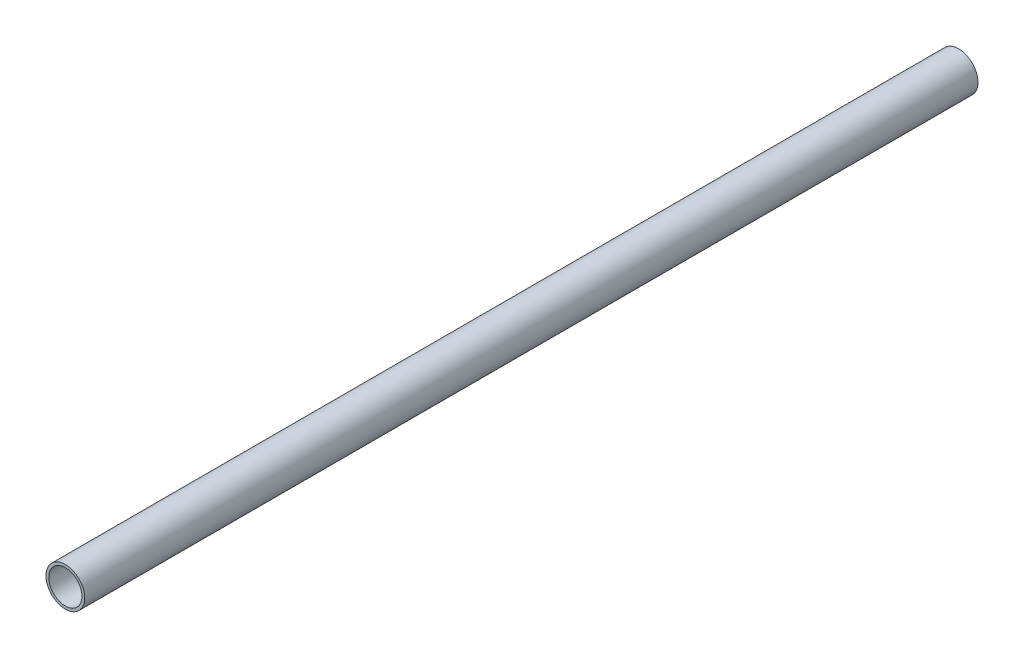
ISO-10303-21;
HEADER;
FILE_DESCRIPTION(('STEP AP214'),'2;1');
FILE_NAME('part.step','',(''),(''),'','','');
FILE_SCHEMA(('AUTOMOTIVE_DESIGN { 1 0 10303 214 1 1 1 1 }'));
ENDSEC;
DATA;
#1=APPLICATION_CONTEXT('core data for automotive mechanical design processes');
#2=APPLICATION_PROTOCOL_DEFINITION('international standard','automotive_design',2000,#1);
#3=PRODUCT_CONTEXT('',#1,'mechanical');
#4=PRODUCT('Part','Part','',(#3));
#5=PRODUCT_RELATED_PRODUCT_CATEGORY('part','',(#4));
#6=PRODUCT_DEFINITION_FORMATION('','',#4);
#7=PRODUCT_DEFINITION_CONTEXT('part definition',#1,'design');
#8=PRODUCT_DEFINITION('design','',#6,#7);
#9=PRODUCT_DEFINITION_SHAPE('','',#8);
#10=(LENGTH_UNIT() NAMED_UNIT(*) SI_UNIT(.MILLI.,.METRE.));
#11=(NAMED_UNIT(*) PLANE_ANGLE_UNIT() SI_UNIT($,.RADIAN.));
#12=(NAMED_UNIT(*) SI_UNIT($,.STERADIAN.) SOLID_ANGLE_UNIT());
#13=UNCERTAINTY_MEASURE_WITH_UNIT(LENGTH_MEASURE(1.E-05),#10,'distance_accuracy_value','');
#14=(GEOMETRIC_REPRESENTATION_CONTEXT(3) GLOBAL_UNCERTAINTY_ASSIGNED_CONTEXT((#13)) GLOBAL_UNIT_ASSIGNED_CONTEXT((#10,
#11,#12)) REPRESENTATION_CONTEXT('',''));
#15=CARTESIAN_POINT('',(0.,0.,0.));
#16=DIRECTION('',(0.,0.,1.));
#17=DIRECTION('',(1.,0.,0.));
#18=AXIS2_PLACEMENT_3D('',#15,#16,#17);
#19=CARTESIAN_POINT('',(0.,0.,256.2352));
#20=DIRECTION('',(0.,0.,1.));
#21=DIRECTION('',(1.,0.,0.));
#22=AXIS2_PLACEMENT_3D('',#19,#20,#21);
#23=PLANE('',#22);
#24=CARTESIAN_POINT('',(0.,0.,256.2352));
#25=DIRECTION('',(0.,0.,1.));
#26=DIRECTION('',(1.,0.,0.));
#27=AXIS2_PLACEMENT_3D('',#24,#25,#26);
#28=CIRCLE('',#27,11.1125);
#29=CARTESIAN_POINT('',(11.1125,0.,256.2352));
#30=VERTEX_POINT('',#29);
#31=EDGE_CURVE('E10',#30,#30,#28,.T.);
#32=ORIENTED_EDGE('',*,*,#31,.T.);
#33=EDGE_LOOP('',(#32));
#34=FACE_BOUND('',#33,.T.);
#35=CARTESIAN_POINT('',(0.,0.,256.2352));
#36=DIRECTION('',(0.,0.,1.));
#37=DIRECTION('',(1.,0.,0.));
#38=AXIS2_PLACEMENT_3D('',#35,#36,#37);
#39=CIRCLE('',#38,9.525);
#40=CARTESIAN_POINT('',(9.525,0.,256.2352));
#41=VERTEX_POINT('',#40);
#42=EDGE_CURVE('E43',#41,#41,#39,.T.);
#43=ORIENTED_EDGE('',*,*,#42,.F.);
#44=EDGE_LOOP('',(#43));
#45=FACE_BOUND('',#44,.T.);
#46=ADVANCED_FACE('F32',(#34,#45),#23,.T.);
#47=CARTESIAN_POINT('',(0.,0.,-256.2352));
#48=DIRECTION('',(0.,0.,1.));
#49=DIRECTION('',(1.,0.,0.));
#50=AXIS2_PLACEMENT_3D('',#47,#48,#49);
#51=PLANE('',#50);
#52=CARTESIAN_POINT('',(0.,0.,-256.2352));
#53=DIRECTION('',(0.,0.,1.));
#54=DIRECTION('',(1.,0.,0.));
#55=AXIS2_PLACEMENT_3D('',#52,#53,#54);
#56=CIRCLE('',#55,11.1125);
#57=CARTESIAN_POINT('',(11.1125,0.,-256.2352));
#58=VERTEX_POINT('',#57);
#59=EDGE_CURVE('E36',#58,#58,#56,.T.);
#60=ORIENTED_EDGE('',*,*,#59,.F.);
#61=EDGE_LOOP('',(#60));
#62=FACE_BOUND('',#61,.T.);
#63=CARTESIAN_POINT('',(0.,0.,-256.2352));
#64=DIRECTION('',(0.,0.,1.));
#65=DIRECTION('',(1.,0.,0.));
#66=AXIS2_PLACEMENT_3D('',#63,#64,#65);
#67=CIRCLE('',#66,9.525);
#68=CARTESIAN_POINT('',(9.525,0.,-256.2352));
#69=VERTEX_POINT('',#68);
#70=EDGE_CURVE('E45',#69,#69,#67,.T.);
#71=ORIENTED_EDGE('',*,*,#70,.T.);
#72=EDGE_LOOP('',(#71));
#73=FACE_BOUND('',#72,.T.);
#74=ADVANCED_FACE('F55',(#62,#73),#51,.F.);
#75=CARTESIAN_POINT('',(0.,0.,256.2352));
#76=DIRECTION('',(0.,0.,-1.));
#77=DIRECTION('',(-1.,0.,0.));
#78=AXIS2_PLACEMENT_3D('',#75,#76,#77);
#79=CYLINDRICAL_SURFACE('',#78,11.1125);
#80=ORIENTED_EDGE('',*,*,#31,.F.);
#81=EDGE_LOOP('',(#80));
#82=FACE_BOUND('',#81,.T.);
#83=ORIENTED_EDGE('',*,*,#59,.T.);
#84=EDGE_LOOP('',(#83));
#85=FACE_BOUND('',#84,.T.);
#86=ADVANCED_FACE('F34',(#82,#85),#79,.T.);
#87=CARTESIAN_POINT('',(0.,0.,256.2352));
#88=DIRECTION('',(0.,0.,-1.));
#89=DIRECTION('',(-1.,0.,0.));
#90=AXIS2_PLACEMENT_3D('',#87,#88,#89);
#91=CYLINDRICAL_SURFACE('',#90,9.525);
#92=ORIENTED_EDGE('',*,*,#42,.T.);
#93=EDGE_LOOP('',(#92));
#94=FACE_BOUND('',#93,.T.);
#95=ORIENTED_EDGE('',*,*,#70,.F.);
#96=EDGE_LOOP('',(#95));
#97=FACE_BOUND('',#96,.T.);
#98=ADVANCED_FACE('F51',(#94,#97),#91,.F.);
#99=CLOSED_SHELL('',(#46,#74,#86,#98));
#100=MANIFOLD_SOLID_BREP('B2',#99);
#101=ADVANCED_BREP_SHAPE_REPRESENTATION('',(#18,#100),#14);
#102=SHAPE_DEFINITION_REPRESENTATION(#9,#101);
ENDSEC;
END-ISO-10303-21;
